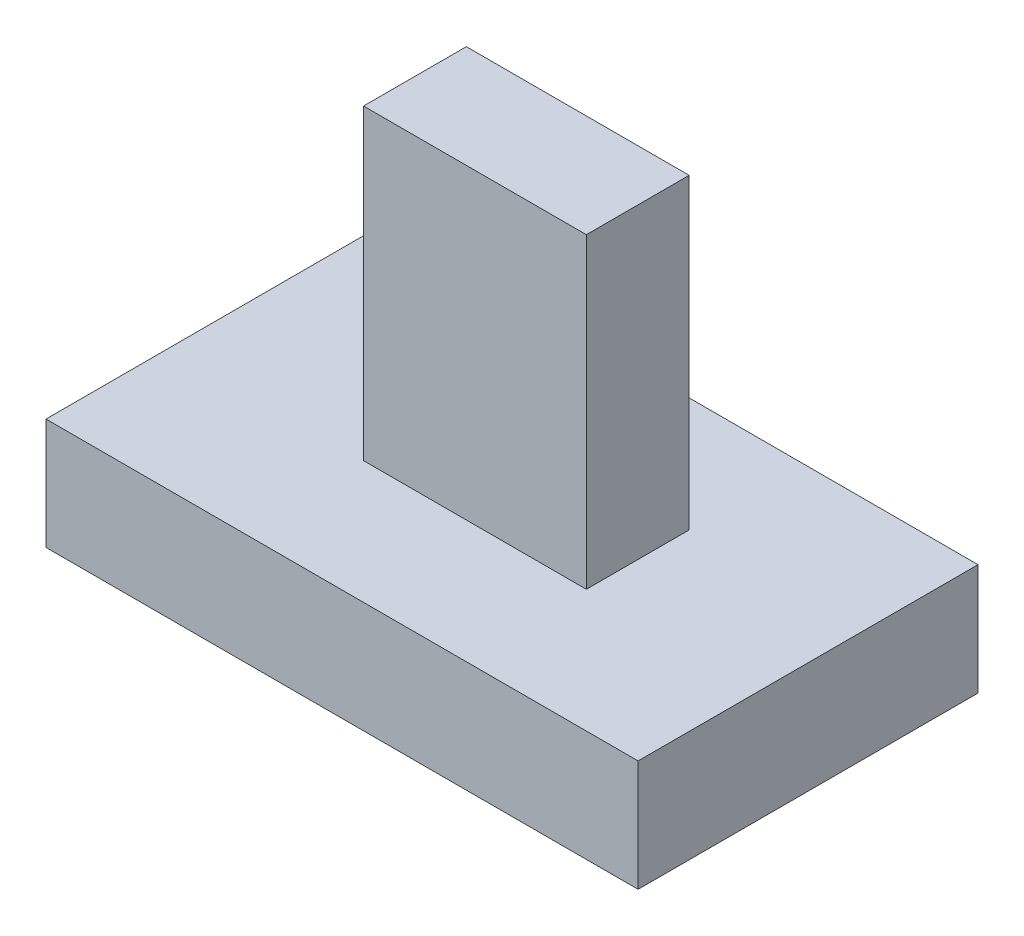
ISO-10303-21;
HEADER;
FILE_DESCRIPTION(('STEP AP214'),'2;1');
FILE_NAME('part.step','',(''),(''),'','','');
FILE_SCHEMA(('AUTOMOTIVE_DESIGN { 1 0 10303 214 1 1 1 1 }'));
ENDSEC;
DATA;
#1=APPLICATION_CONTEXT('core data for automotive mechanical design processes');
#2=APPLICATION_PROTOCOL_DEFINITION('international standard','automotive_design',2000,#1);
#3=PRODUCT_CONTEXT('',#1,'mechanical');
#4=PRODUCT('Part','Part','',(#3));
#5=PRODUCT_RELATED_PRODUCT_CATEGORY('part','',(#4));
#6=PRODUCT_DEFINITION_FORMATION('','',#4);
#7=PRODUCT_DEFINITION_CONTEXT('part definition',#1,'design');
#8=PRODUCT_DEFINITION('design','',#6,#7);
#9=PRODUCT_DEFINITION_SHAPE('','',#8);
#10=(LENGTH_UNIT() NAMED_UNIT(*) SI_UNIT(.MILLI.,.METRE.));
#11=(NAMED_UNIT(*) PLANE_ANGLE_UNIT() SI_UNIT($,.RADIAN.));
#12=(NAMED_UNIT(*) SI_UNIT($,.STERADIAN.) SOLID_ANGLE_UNIT());
#13=UNCERTAINTY_MEASURE_WITH_UNIT(LENGTH_MEASURE(1.E-05),#10,'distance_accuracy_value','');
#14=(GEOMETRIC_REPRESENTATION_CONTEXT(3) GLOBAL_UNCERTAINTY_ASSIGNED_CONTEXT((#13)) GLOBAL_UNIT_ASSIGNED_CONTEXT((#10,
#11,#12)) REPRESENTATION_CONTEXT('',''));
#15=CARTESIAN_POINT('',(0.,0.,0.));
#16=DIRECTION('',(0.,0.,1.));
#17=DIRECTION('',(1.,0.,0.));
#18=AXIS2_PLACEMENT_3D('',#15,#16,#17);
#19=CARTESIAN_POINT('',(-16.1637176505565,64.008,-8.17000124908418));
#20=DIRECTION('',(1.,0.,0.));
#21=DIRECTION('',(0.,0.,-1.));
#22=AXIS2_PLACEMENT_3D('',#19,#20,#21);
#23=PLANE('',#22);
#24=DIRECTION('',(0.,0.,1.));
#25=VECTOR('',#24,1.);
#26=CARTESIAN_POINT('',(-16.1637176505565,17.018,-8.17000124908418));
#27=LINE('',#26,#25);
#28=CARTESIAN_POINT('',(-16.1637176505565,17.018,-8.17000124908418));
#29=VERTEX_POINT('',#28);
#30=CARTESIAN_POINT('',(-16.1637176505565,17.018,7.55892789766222));
#31=VERTEX_POINT('',#30);
#32=EDGE_CURVE('E109',#29,#31,#27,.T.);
#33=ORIENTED_EDGE('',*,*,#32,.T.);
#34=DIRECTION('',(0.,-1.,0.));
#35=VECTOR('',#34,1.);
#36=CARTESIAN_POINT('',(-16.1637176505565,64.008,7.55892789766222));
#37=LINE('',#36,#35);
#38=CARTESIAN_POINT('',(-16.1637176505565,64.008,7.55892789766222));
#39=VERTEX_POINT('',#38);
#40=EDGE_CURVE('E12',#39,#31,#37,.T.);
#41=ORIENTED_EDGE('',*,*,#40,.F.);
#42=DIRECTION('',(0.,0.,1.));
#43=VECTOR('',#42,1.);
#44=CARTESIAN_POINT('',(-16.1637176505565,64.008,-8.17000124908418));
#45=LINE('',#44,#43);
#46=CARTESIAN_POINT('',(-16.1637176505565,64.008,-8.17000124908418));
#47=VERTEX_POINT('',#46);
#48=EDGE_CURVE('E97',#47,#39,#45,.T.);
#49=ORIENTED_EDGE('',*,*,#48,.F.);
#50=DIRECTION('',(0.,-1.,0.));
#51=VECTOR('',#50,1.);
#52=CARTESIAN_POINT('',(-16.1637176505565,64.008,-8.17000124908418));
#53=LINE('',#52,#51);
#54=EDGE_CURVE('E105',#47,#29,#53,.T.);
#55=ORIENTED_EDGE('',*,*,#54,.T.);
#56=EDGE_LOOP('',(#33,#41,#49,#55));
#57=FACE_BOUND('',#56,.T.);
#58=ADVANCED_FACE('F46',(#57),#23,.F.);
#59=CARTESIAN_POINT('',(-16.1637176505565,64.008,7.55892789766222));
#60=DIRECTION('',(0.,0.,-1.));
#61=DIRECTION('',(-1.,0.,0.));
#62=AXIS2_PLACEMENT_3D('',#59,#60,#61);
#63=PLANE('',#62);
#64=DIRECTION('',(1.,0.,0.));
#65=VECTOR('',#64,1.);
#66=CARTESIAN_POINT('',(-16.1637176505565,17.018,7.55892789766222));
#67=LINE('',#66,#65);
#68=CARTESIAN_POINT('',(17.9278335630784,17.018,7.55892789766222));
#69=VERTEX_POINT('',#68);
#70=EDGE_CURVE('E101',#31,#69,#67,.T.);
#71=ORIENTED_EDGE('',*,*,#70,.T.);
#72=DIRECTION('',(0.,-1.,0.));
#73=VECTOR('',#72,1.);
#74=CARTESIAN_POINT('',(17.9278335630784,64.008,7.55892789766222));
#75=LINE('',#74,#73);
#76=CARTESIAN_POINT('',(17.9278335630784,64.008,7.55892789766222));
#77=VERTEX_POINT('',#76);
#78=EDGE_CURVE('E54',#77,#69,#75,.T.);
#79=ORIENTED_EDGE('',*,*,#78,.F.);
#80=DIRECTION('',(1.,0.,0.));
#81=VECTOR('',#80,1.);
#82=CARTESIAN_POINT('',(-16.1637176505565,64.008,7.55892789766222));
#83=LINE('',#82,#81);
#84=EDGE_CURVE('E92',#39,#77,#83,.T.);
#85=ORIENTED_EDGE('',*,*,#84,.F.);
#86=ORIENTED_EDGE('',*,*,#40,.T.);
#87=EDGE_LOOP('',(#71,#79,#85,#86));
#88=FACE_BOUND('',#87,.T.);
#89=ADVANCED_FACE('F100',(#88),#63,.F.);
#90=CARTESIAN_POINT('',(17.9278335630784,64.008,-8.17000124908418));
#91=DIRECTION('',(-1.,0.,0.));
#92=DIRECTION('',(0.,0.,1.));
#93=AXIS2_PLACEMENT_3D('',#90,#91,#92);
#94=PLANE('',#93);
#95=DIRECTION('',(0.,0.,-1.));
#96=VECTOR('',#95,1.);
#97=CARTESIAN_POINT('',(17.9278335630784,17.018,-8.17000124908418));
#98=LINE('',#97,#96);
#99=CARTESIAN_POINT('',(17.9278335630784,17.018,-8.17000124908418));
#100=VERTEX_POINT('',#99);
#101=EDGE_CURVE('E79',#69,#100,#98,.T.);
#102=ORIENTED_EDGE('',*,*,#101,.T.);
#103=DIRECTION('',(0.,-1.,0.));
#104=VECTOR('',#103,1.);
#105=CARTESIAN_POINT('',(17.9278335630784,64.008,-8.17000124908418));
#106=LINE('',#105,#104);
#107=CARTESIAN_POINT('',(17.9278335630784,64.008,-8.17000124908418));
#108=VERTEX_POINT('',#107);
#109=EDGE_CURVE('E102',#108,#100,#106,.T.);
#110=ORIENTED_EDGE('',*,*,#109,.F.);
#111=DIRECTION('',(0.,0.,-1.));
#112=VECTOR('',#111,1.);
#113=CARTESIAN_POINT('',(17.9278335630784,64.008,-8.17000124908418));
#114=LINE('',#113,#112);
#115=EDGE_CURVE('E95',#77,#108,#114,.T.);
#116=ORIENTED_EDGE('',*,*,#115,.F.);
#117=ORIENTED_EDGE('',*,*,#78,.T.);
#118=EDGE_LOOP('',(#102,#110,#116,#117));
#119=FACE_BOUND('',#118,.T.);
#120=ADVANCED_FACE('F103',(#119),#94,.F.);
#121=CARTESIAN_POINT('',(-16.1637176505565,64.008,-8.17000124908418));
#122=DIRECTION('',(0.,0.,1.));
#123=DIRECTION('',(1.,0.,0.));
#124=AXIS2_PLACEMENT_3D('',#121,#122,#123);
#125=PLANE('',#124);
#126=DIRECTION('',(-1.,0.,0.));
#127=VECTOR('',#126,1.);
#128=CARTESIAN_POINT('',(-16.1637176505565,17.018,-8.17000124908418));
#129=LINE('',#128,#127);
#130=EDGE_CURVE('E85',#100,#29,#129,.T.);
#131=ORIENTED_EDGE('',*,*,#130,.T.);
#132=ORIENTED_EDGE('',*,*,#54,.F.);
#133=DIRECTION('',(-1.,0.,0.));
#134=VECTOR('',#133,1.);
#135=CARTESIAN_POINT('',(-16.1637176505565,64.008,-8.17000124908418));
#136=LINE('',#135,#134);
#137=EDGE_CURVE('E62',#108,#47,#136,.T.);
#138=ORIENTED_EDGE('',*,*,#137,.F.);
#139=ORIENTED_EDGE('',*,*,#109,.T.);
#140=EDGE_LOOP('',(#131,#132,#138,#139));
#141=FACE_BOUND('',#140,.T.);
#142=ADVANCED_FACE('F116',(#141),#125,.F.);
#143=CARTESIAN_POINT('',(0.,64.008,0.));
#144=DIRECTION('',(0.,1.,0.));
#145=DIRECTION('',(0.,0.,1.));
#146=AXIS2_PLACEMENT_3D('',#143,#144,#145);
#147=PLANE('',#146);
#148=ORIENTED_EDGE('',*,*,#48,.T.);
#149=ORIENTED_EDGE('',*,*,#84,.T.);
#150=ORIENTED_EDGE('',*,*,#115,.T.);
#151=ORIENTED_EDGE('',*,*,#137,.T.);
#152=EDGE_LOOP('',(#148,#149,#150,#151));
#153=FACE_BOUND('',#152,.T.);
#154=ADVANCED_FACE('F93',(#153),#147,.T.);
#155=CARTESIAN_POINT('',(0.,17.018,0.));
#156=DIRECTION('',(0.,1.,0.));
#157=DIRECTION('',(0.,0.,1.));
#158=AXIS2_PLACEMENT_3D('',#155,#156,#157);
#159=PLANE('',#158);
#160=ORIENTED_EDGE('',*,*,#32,.F.);
#161=ORIENTED_EDGE('',*,*,#130,.F.);
#162=ORIENTED_EDGE('',*,*,#101,.F.);
#163=ORIENTED_EDGE('',*,*,#70,.F.);
#164=EDGE_LOOP('',(#160,#161,#162,#163));
#165=FACE_BOUND('',#164,.T.);
#166=ADVANCED_FACE('F119',(#165),#159,.F.);
#167=CLOSED_SHELL('',(#58,#89,#120,#142,#154,#166));
#168=MANIFOLD_SOLID_BREP('B2',#167);
#169=CARTESIAN_POINT('',(-45.9667756299321,17.018,-25.6675790926263));
#170=DIRECTION('',(1.,0.,0.));
#171=DIRECTION('',(0.,0.,-1.));
#172=AXIS2_PLACEMENT_3D('',#169,#170,#171);
#173=PLANE('',#172);
#174=DIRECTION('',(0.,0.,1.));
#175=VECTOR('',#174,1.);
#176=CARTESIAN_POINT('',(-45.9667756299321,0.,-25.6675790926263));
#177=LINE('',#176,#175);
#178=CARTESIAN_POINT('',(-45.9667756299321,0.,-25.6675790926263));
#179=VERTEX_POINT('',#178);
#180=CARTESIAN_POINT('',(-45.9667756299321,0.,26.3386269120414));
#181=VERTEX_POINT('',#180);
#182=EDGE_CURVE('E259',#179,#181,#177,.T.);
#183=ORIENTED_EDGE('',*,*,#182,.T.);
#184=DIRECTION('',(0.,-1.,0.));
#185=VECTOR('',#184,1.);
#186=CARTESIAN_POINT('',(-45.9667756299321,17.018,26.3386269120414));
#187=LINE('',#186,#185);
#188=CARTESIAN_POINT('',(-45.9667756299321,17.018,26.3386269120414));
#189=VERTEX_POINT('',#188);
#190=EDGE_CURVE('E288',#189,#181,#187,.T.);
#191=ORIENTED_EDGE('',*,*,#190,.F.);
#192=DIRECTION('',(0.,0.,1.));
#193=VECTOR('',#192,1.);
#194=CARTESIAN_POINT('',(-45.9667756299321,17.018,-25.6675790926263));
#195=LINE('',#194,#193);
#196=CARTESIAN_POINT('',(-45.9667756299321,17.018,-25.6675790926263));
#197=VERTEX_POINT('',#196);
#198=EDGE_CURVE('E262',#197,#189,#195,.T.);
#199=ORIENTED_EDGE('',*,*,#198,.F.);
#200=DIRECTION('',(0.,-1.,0.));
#201=VECTOR('',#200,1.);
#202=CARTESIAN_POINT('',(-45.9667756299321,17.018,-25.6675790926263));
#203=LINE('',#202,#201);
#204=EDGE_CURVE('E272',#197,#179,#203,.T.);
#205=ORIENTED_EDGE('',*,*,#204,.T.);
#206=EDGE_LOOP('',(#183,#191,#199,#205));
#207=FACE_BOUND('',#206,.T.);
#208=ADVANCED_FACE('F169',(#207),#173,.F.);
#209=CARTESIAN_POINT('',(-45.9667756299321,17.018,26.3386269120414));
#210=DIRECTION('',(0.,0.,-1.));
#211=DIRECTION('',(-1.,0.,0.));
#212=AXIS2_PLACEMENT_3D('',#209,#210,#211);
#213=PLANE('',#212);
#214=DIRECTION('',(1.,0.,0.));
#215=VECTOR('',#214,1.);
#216=CARTESIAN_POINT('',(-45.9667756299321,0.,26.3386269120414));
#217=LINE('',#216,#215);
#218=CARTESIAN_POINT('',(44.624679991102,0.,26.3386269120414));
#219=VERTEX_POINT('',#218);
#220=EDGE_CURVE('E275',#181,#219,#217,.T.);
#221=ORIENTED_EDGE('',*,*,#220,.T.);
#222=DIRECTION('',(0.,-1.,0.));
#223=VECTOR('',#222,1.);
#224=CARTESIAN_POINT('',(44.624679991102,17.018,26.3386269120414));
#225=LINE('',#224,#223);
#226=CARTESIAN_POINT('',(44.624679991102,17.018,26.3386269120414));
#227=VERTEX_POINT('',#226);
#228=EDGE_CURVE('E285',#227,#219,#225,.T.);
#229=ORIENTED_EDGE('',*,*,#228,.F.);
#230=DIRECTION('',(1.,0.,0.));
#231=VECTOR('',#230,1.);
#232=CARTESIAN_POINT('',(-45.9667756299321,17.018,26.3386269120414));
#233=LINE('',#232,#231);
#234=EDGE_CURVE('E265',#189,#227,#233,.T.);
#235=ORIENTED_EDGE('',*,*,#234,.F.);
#236=ORIENTED_EDGE('',*,*,#190,.T.);
#237=EDGE_LOOP('',(#221,#229,#235,#236));
#238=FACE_BOUND('',#237,.T.);
#239=ADVANCED_FACE('F312',(#238),#213,.F.);
#240=CARTESIAN_POINT('',(44.624679991102,17.018,-25.6675790926263));
#241=DIRECTION('',(-1.,0.,0.));
#242=DIRECTION('',(0.,0.,1.));
#243=AXIS2_PLACEMENT_3D('',#240,#241,#242);
#244=PLANE('',#243);
#245=DIRECTION('',(0.,0.,-1.));
#246=VECTOR('',#245,1.);
#247=CARTESIAN_POINT('',(44.624679991102,0.,-25.6675790926263));
#248=LINE('',#247,#246);
#249=CARTESIAN_POINT('',(44.624679991102,0.,-25.6675790926263));
#250=VERTEX_POINT('',#249);
#251=EDGE_CURVE('E277',#219,#250,#248,.T.);
#252=ORIENTED_EDGE('',*,*,#251,.T.);
#253=DIRECTION('',(0.,-1.,0.));
#254=VECTOR('',#253,1.);
#255=CARTESIAN_POINT('',(44.624679991102,17.018,-25.6675790926263));
#256=LINE('',#255,#254);
#257=CARTESIAN_POINT('',(44.624679991102,17.018,-25.6675790926263));
#258=VERTEX_POINT('',#257);
#259=EDGE_CURVE('E282',#258,#250,#256,.T.);
#260=ORIENTED_EDGE('',*,*,#259,.F.);
#261=DIRECTION('',(0.,0.,-1.));
#262=VECTOR('',#261,1.);
#263=CARTESIAN_POINT('',(44.624679991102,17.018,-25.6675790926263));
#264=LINE('',#263,#262);
#265=EDGE_CURVE('E268',#227,#258,#264,.T.);
#266=ORIENTED_EDGE('',*,*,#265,.F.);
#267=ORIENTED_EDGE('',*,*,#228,.T.);
#268=EDGE_LOOP('',(#252,#260,#266,#267));
#269=FACE_BOUND('',#268,.T.);
#270=ADVANCED_FACE('F317',(#269),#244,.F.);
#271=CARTESIAN_POINT('',(-45.9667756299321,17.018,-25.6675790926263));
#272=DIRECTION('',(0.,0.,1.));
#273=DIRECTION('',(1.,0.,0.));
#274=AXIS2_PLACEMENT_3D('',#271,#272,#273);
#275=PLANE('',#274);
#276=DIRECTION('',(-1.,0.,0.));
#277=VECTOR('',#276,1.);
#278=CARTESIAN_POINT('',(-45.9667756299321,0.,-25.6675790926263));
#279=LINE('',#278,#277);
#280=EDGE_CURVE('E266',#250,#179,#279,.T.);
#281=ORIENTED_EDGE('',*,*,#280,.T.);
#282=ORIENTED_EDGE('',*,*,#204,.F.);
#283=DIRECTION('',(-1.,0.,0.));
#284=VECTOR('',#283,1.);
#285=CARTESIAN_POINT('',(-45.9667756299321,17.018,-25.6675790926263));
#286=LINE('',#285,#284);
#287=EDGE_CURVE('E270',#258,#197,#286,.T.);
#288=ORIENTED_EDGE('',*,*,#287,.F.);
#289=ORIENTED_EDGE('',*,*,#259,.T.);
#290=EDGE_LOOP('',(#281,#282,#288,#289));
#291=FACE_BOUND('',#290,.T.);
#292=ADVANCED_FACE('F330',(#291),#275,.F.);
#293=CARTESIAN_POINT('',(0.,17.018,0.));
#294=DIRECTION('',(0.,1.,0.));
#295=DIRECTION('',(0.,0.,1.));
#296=AXIS2_PLACEMENT_3D('',#293,#294,#295);
#297=PLANE('',#296);
#298=DIRECTION('',(0.,0.,1.));
#299=VECTOR('',#298,1.);
#300=CARTESIAN_POINT('',(-16.1637176505565,17.018,-8.17000124908418));
#301=LINE('',#300,#299);
#302=CARTESIAN_POINT('',(-16.1637176505565,17.018,-8.17000124908418));
#303=VERTEX_POINT('',#302);
#304=CARTESIAN_POINT('',(-16.1637176505565,17.018,7.55892789766222));
#305=VERTEX_POINT('',#304);
#306=EDGE_CURVE('E183',#303,#305,#301,.T.);
#307=ORIENTED_EDGE('',*,*,#306,.F.);
#308=DIRECTION('',(-1.,0.,0.));
#309=VECTOR('',#308,1.);
#310=CARTESIAN_POINT('',(-16.1637176505565,17.018,-8.17000124908418));
#311=LINE('',#310,#309);
#312=CARTESIAN_POINT('',(17.9278335630784,17.018,-8.17000124908418));
#313=VERTEX_POINT('',#312);
#314=EDGE_CURVE('E252',#313,#303,#311,.T.);
#315=ORIENTED_EDGE('',*,*,#314,.F.);
#316=DIRECTION('',(0.,0.,-1.));
#317=VECTOR('',#316,1.);
#318=CARTESIAN_POINT('',(17.9278335630784,17.018,-8.17000124908418));
#319=LINE('',#318,#317);
#320=CARTESIAN_POINT('',(17.9278335630784,17.018,7.55892789766222));
#321=VERTEX_POINT('',#320);
#322=EDGE_CURVE('E236',#321,#313,#319,.T.);
#323=ORIENTED_EDGE('',*,*,#322,.F.);
#324=DIRECTION('',(1.,0.,0.));
#325=VECTOR('',#324,1.);
#326=CARTESIAN_POINT('',(-16.1637176505565,17.018,7.55892789766222));
#327=LINE('',#326,#325);
#328=EDGE_CURVE('E245',#305,#321,#327,.T.);
#329=ORIENTED_EDGE('',*,*,#328,.F.);
#330=EDGE_LOOP('',(#307,#315,#323,#329));
#331=FACE_BOUND('',#330,.T.);
#332=ORIENTED_EDGE('',*,*,#198,.T.);
#333=ORIENTED_EDGE('',*,*,#234,.T.);
#334=ORIENTED_EDGE('',*,*,#265,.T.);
#335=ORIENTED_EDGE('',*,*,#287,.T.);
#336=EDGE_LOOP('',(#332,#333,#334,#335));
#337=FACE_BOUND('',#336,.T.);
#338=ADVANCED_FACE('F249',(#331,#337),#297,.T.);
#339=CARTESIAN_POINT('',(0.,0.,0.));
#340=DIRECTION('',(0.,1.,0.));
#341=DIRECTION('',(0.,0.,1.));
#342=AXIS2_PLACEMENT_3D('',#339,#340,#341);
#343=PLANE('',#342);
#344=DIRECTION('',(-1.,0.,0.));
#345=VECTOR('',#344,1.);
#346=CARTESIAN_POINT('',(0.,0.,-8.17000124908418));
#347=LINE('',#346,#345);
#348=CARTESIAN_POINT('',(17.9278335630784,0.,-8.17000124908418));
#349=VERTEX_POINT('',#348);
#350=CARTESIAN_POINT('',(-16.1637176505565,0.,-8.17000124908418));
#351=VERTEX_POINT('',#350);
#352=EDGE_CURVE('E176',#349,#351,#347,.T.);
#353=ORIENTED_EDGE('',*,*,#352,.T.);
#354=DIRECTION('',(0.,0.,1.));
#355=VECTOR('',#354,1.);
#356=CARTESIAN_POINT('',(-16.1637176505565,0.,0.));
#357=LINE('',#356,#355);
#358=CARTESIAN_POINT('',(-16.1637176505565,0.,7.55892789766222));
#359=VERTEX_POINT('',#358);
#360=EDGE_CURVE('E44',#351,#359,#357,.T.);
#361=ORIENTED_EDGE('',*,*,#360,.T.);
#362=DIRECTION('',(1.,0.,0.));
#363=VECTOR('',#362,1.);
#364=CARTESIAN_POINT('',(0.,0.,7.55892789766222));
#365=LINE('',#364,#363);
#366=CARTESIAN_POINT('',(17.9278335630784,0.,7.55892789766222));
#367=VERTEX_POINT('',#366);
#368=EDGE_CURVE('E291',#359,#367,#365,.T.);
#369=ORIENTED_EDGE('',*,*,#368,.T.);
#370=DIRECTION('',(0.,0.,-1.));
#371=VECTOR('',#370,1.);
#372=CARTESIAN_POINT('',(17.9278335630784,0.,0.));
#373=LINE('',#372,#371);
#374=EDGE_CURVE('E239',#367,#349,#373,.T.);
#375=ORIENTED_EDGE('',*,*,#374,.T.);
#376=EDGE_LOOP('',(#353,#361,#369,#375));
#377=FACE_BOUND('',#376,.T.);
#378=ORIENTED_EDGE('',*,*,#182,.F.);
#379=ORIENTED_EDGE('',*,*,#280,.F.);
#380=ORIENTED_EDGE('',*,*,#251,.F.);
#381=ORIENTED_EDGE('',*,*,#220,.F.);
#382=EDGE_LOOP('',(#378,#379,#380,#381));
#383=FACE_BOUND('',#382,.T.);
#384=ADVANCED_FACE('F295',(#377,#383),#343,.F.);
#385=CARTESIAN_POINT('',(-16.1637176505565,-29.972,-8.17000124908418));
#386=DIRECTION('',(-1.,0.,0.));
#387=DIRECTION('',(0.,0.,1.));
#388=AXIS2_PLACEMENT_3D('',#385,#386,#387);
#389=PLANE('',#388);
#390=DIRECTION('',(0.,1.,0.));
#391=VECTOR('',#390,1.);
#392=CARTESIAN_POINT('',(-16.1637176505565,-29.972,-8.17000124908418));
#393=LINE('',#392,#391);
#394=EDGE_CURVE('E257',#351,#303,#393,.T.);
#395=ORIENTED_EDGE('',*,*,#394,.T.);
#396=ORIENTED_EDGE('',*,*,#306,.T.);
#397=DIRECTION('',(0.,1.,0.));
#398=VECTOR('',#397,1.);
#399=CARTESIAN_POINT('',(-16.1637176505565,-29.972,7.55892789766222));
#400=LINE('',#399,#398);
#401=EDGE_CURVE('E242',#359,#305,#400,.T.);
#402=ORIENTED_EDGE('',*,*,#401,.F.);
#403=ORIENTED_EDGE('',*,*,#360,.F.);
#404=EDGE_LOOP('',(#395,#396,#402,#403));
#405=FACE_BOUND('',#404,.T.);
#406=ADVANCED_FACE('F300',(#405),#389,.F.);
#407=CARTESIAN_POINT('',(-16.1637176505565,-29.972,-8.17000124908418));
#408=DIRECTION('',(0.,0.,-1.));
#409=DIRECTION('',(-1.,0.,0.));
#410=AXIS2_PLACEMENT_3D('',#407,#408,#409);
#411=PLANE('',#410);
#412=DIRECTION('',(0.,1.,0.));
#413=VECTOR('',#412,1.);
#414=CARTESIAN_POINT('',(17.9278335630784,-29.972,-8.17000124908418));
#415=LINE('',#414,#413);
#416=EDGE_CURVE('E241',#349,#313,#415,.T.);
#417=ORIENTED_EDGE('',*,*,#416,.T.);
#418=ORIENTED_EDGE('',*,*,#314,.T.);
#419=ORIENTED_EDGE('',*,*,#394,.F.);
#420=ORIENTED_EDGE('',*,*,#352,.F.);
#421=EDGE_LOOP('',(#417,#418,#419,#420));
#422=FACE_BOUND('',#421,.T.);
#423=ADVANCED_FACE('F299',(#422),#411,.F.);
#424=CARTESIAN_POINT('',(17.9278335630784,-29.972,-8.17000124908418));
#425=DIRECTION('',(1.,0.,0.));
#426=DIRECTION('',(0.,0.,-1.));
#427=AXIS2_PLACEMENT_3D('',#424,#425,#426);
#428=PLANE('',#427);
#429=DIRECTION('',(0.,1.,0.));
#430=VECTOR('',#429,1.);
#431=CARTESIAN_POINT('',(17.9278335630784,-29.972,7.55892789766222));
#432=LINE('',#431,#430);
#433=EDGE_CURVE('E191',#367,#321,#432,.T.);
#434=ORIENTED_EDGE('',*,*,#433,.T.);
#435=ORIENTED_EDGE('',*,*,#322,.T.);
#436=ORIENTED_EDGE('',*,*,#416,.F.);
#437=ORIENTED_EDGE('',*,*,#374,.F.);
#438=EDGE_LOOP('',(#434,#435,#436,#437));
#439=FACE_BOUND('',#438,.T.);
#440=ADVANCED_FACE('F233',(#439),#428,.F.);
#441=CARTESIAN_POINT('',(-16.1637176505565,-29.972,7.55892789766222));
#442=DIRECTION('',(0.,0.,1.));
#443=DIRECTION('',(1.,0.,0.));
#444=AXIS2_PLACEMENT_3D('',#441,#442,#443);
#445=PLANE('',#444);
#446=ORIENTED_EDGE('',*,*,#401,.T.);
#447=ORIENTED_EDGE('',*,*,#328,.T.);
#448=ORIENTED_EDGE('',*,*,#433,.F.);
#449=ORIENTED_EDGE('',*,*,#368,.F.);
#450=EDGE_LOOP('',(#446,#447,#448,#449));
#451=FACE_BOUND('',#450,.T.);
#452=ADVANCED_FACE('F246',(#451),#445,.F.);
#453=CLOSED_SHELL('',(#208,#239,#270,#292,#338,#384,#406,#423,#440,#452));
#454=MANIFOLD_SOLID_BREP('B6',#453);
#455=ADVANCED_BREP_SHAPE_REPRESENTATION('',(#18,#168,#454),#14);
#456=SHAPE_DEFINITION_REPRESENTATION(#9,#455);
ENDSEC;
END-ISO-10303-21;
